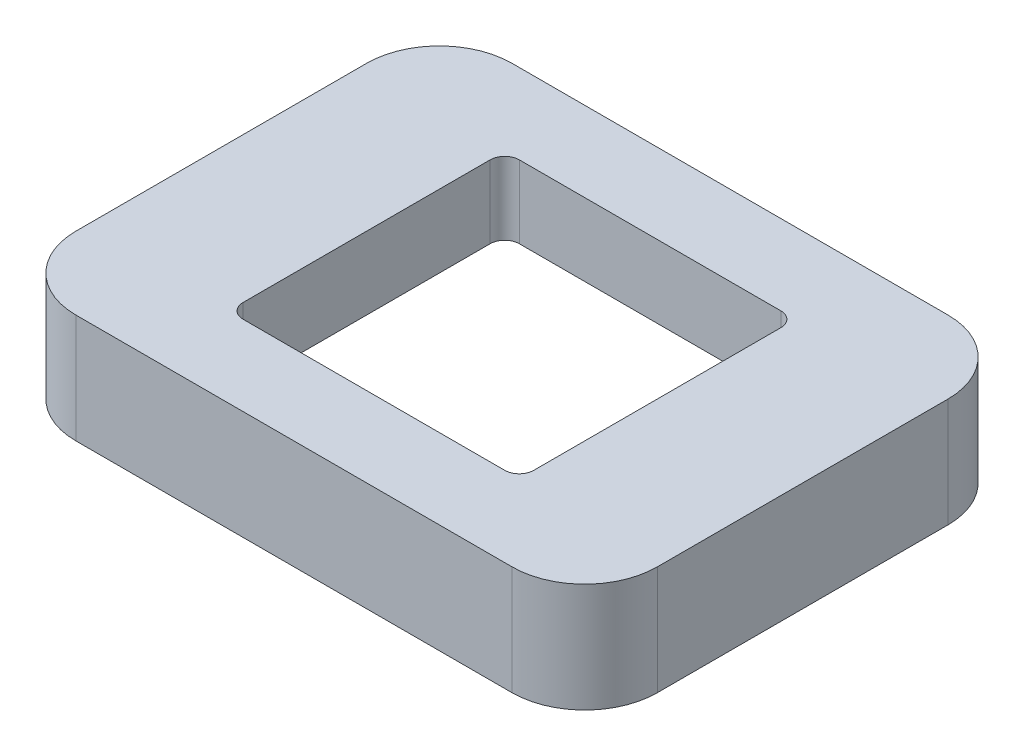
ISO-10303-21;
HEADER;
FILE_DESCRIPTION(('STEP AP214'),'2;1');
FILE_NAME('part.step','',(''),(''),'','','');
FILE_SCHEMA(('AUTOMOTIVE_DESIGN { 1 0 10303 214 1 1 1 1 }'));
ENDSEC;
DATA;
#1=APPLICATION_CONTEXT('core data for automotive mechanical design processes');
#2=APPLICATION_PROTOCOL_DEFINITION('international standard','automotive_design',2000,#1);
#3=PRODUCT_CONTEXT('',#1,'mechanical');
#4=PRODUCT('Part','Part','',(#3));
#5=PRODUCT_RELATED_PRODUCT_CATEGORY('part','',(#4));
#6=PRODUCT_DEFINITION_FORMATION('','',#4);
#7=PRODUCT_DEFINITION_CONTEXT('part definition',#1,'design');
#8=PRODUCT_DEFINITION('design','',#6,#7);
#9=PRODUCT_DEFINITION_SHAPE('','',#8);
#10=(LENGTH_UNIT() NAMED_UNIT(*) SI_UNIT(.MILLI.,.METRE.));
#11=(NAMED_UNIT(*) PLANE_ANGLE_UNIT() SI_UNIT($,.RADIAN.));
#12=(NAMED_UNIT(*) SI_UNIT($,.STERADIAN.) SOLID_ANGLE_UNIT());
#13=UNCERTAINTY_MEASURE_WITH_UNIT(LENGTH_MEASURE(1.E-05),#10,'distance_accuracy_value','');
#14=(GEOMETRIC_REPRESENTATION_CONTEXT(3) GLOBAL_UNCERTAINTY_ASSIGNED_CONTEXT((#13)) GLOBAL_UNIT_ASSIGNED_CONTEXT((#10,
#11,#12)) REPRESENTATION_CONTEXT('',''));
#15=CARTESIAN_POINT('',(0.,0.,0.));
#16=DIRECTION('',(0.,0.,1.));
#17=DIRECTION('',(1.,0.,0.));
#18=AXIS2_PLACEMENT_3D('',#15,#16,#17);
#19=CARTESIAN_POINT('',(10.,15.,50.));
#20=DIRECTION('',(0.,1.,0.));
#21=DIRECTION('',(0.,0.,1.));
#22=AXIS2_PLACEMENT_3D('',#19,#20,#21);
#23=PLANE('',#22);
#24=CARTESIAN_POINT('',(10.,15.,50.));
#25=DIRECTION('',(0.,1.,0.));
#26=DIRECTION('',(0.,0.,1.));
#27=AXIS2_PLACEMENT_3D('',#24,#25,#26);
#28=CIRCLE('',#27,10.);
#29=CARTESIAN_POINT('',(0.,15.,49.9999999999999));
#30=VERTEX_POINT('',#29);
#31=CARTESIAN_POINT('',(10.0000000000001,15.,60.));
#32=VERTEX_POINT('',#31);
#33=EDGE_CURVE('E376',#30,#32,#28,.T.);
#34=ORIENTED_EDGE('',*,*,#33,.T.);
#35=DIRECTION('',(1.,0.,0.));
#36=VECTOR('',#35,1.);
#37=CARTESIAN_POINT('',(10.0000000000001,15.,60.));
#38=LINE('',#37,#36);
#39=CARTESIAN_POINT('',(69.9999999999999,15.,60.));
#40=VERTEX_POINT('',#39);
#41=EDGE_CURVE('E380',#32,#40,#38,.T.);
#42=ORIENTED_EDGE('',*,*,#41,.T.);
#43=CARTESIAN_POINT('',(70.,15.,50.));
#44=DIRECTION('',(0.,1.,0.));
#45=DIRECTION('',(0.,0.,-1.));
#46=AXIS2_PLACEMENT_3D('',#43,#44,#45);
#47=CIRCLE('',#46,10.);
#48=CARTESIAN_POINT('',(80.,15.,49.9999999999999));
#49=VERTEX_POINT('',#48);
#50=EDGE_CURVE('E384',#40,#49,#47,.T.);
#51=ORIENTED_EDGE('',*,*,#50,.T.);
#52=DIRECTION('',(0.,0.,-1.));
#53=VECTOR('',#52,1.);
#54=CARTESIAN_POINT('',(80.,15.,10.0000000000001));
#55=LINE('',#54,#53);
#56=CARTESIAN_POINT('',(80.,15.,10.0000000000001));
#57=VERTEX_POINT('',#56);
#58=EDGE_CURVE('E387',#49,#57,#55,.T.);
#59=ORIENTED_EDGE('',*,*,#58,.T.);
#60=CARTESIAN_POINT('',(70.,15.,10.));
#61=DIRECTION('',(0.,1.,0.));
#62=DIRECTION('',(0.,0.,-1.));
#63=AXIS2_PLACEMENT_3D('',#60,#61,#62);
#64=CIRCLE('',#63,10.);
#65=CARTESIAN_POINT('',(69.9999999999999,15.,0.));
#66=VERTEX_POINT('',#65);
#67=EDGE_CURVE('E390',#57,#66,#64,.T.);
#68=ORIENTED_EDGE('',*,*,#67,.T.);
#69=DIRECTION('',(-1.,0.,0.));
#70=VECTOR('',#69,1.);
#71=CARTESIAN_POINT('',(10.0000000000001,15.,0.));
#72=LINE('',#71,#70);
#73=CARTESIAN_POINT('',(10.,15.,0.));
#74=VERTEX_POINT('',#73);
#75=EDGE_CURVE('E393',#66,#74,#72,.T.);
#76=ORIENTED_EDGE('',*,*,#75,.T.);
#77=CARTESIAN_POINT('',(10.,15.,10.));
#78=DIRECTION('',(0.,1.,0.));
#79=DIRECTION('',(0.,0.,-1.));
#80=AXIS2_PLACEMENT_3D('',#77,#78,#79);
#81=CIRCLE('',#80,10.);
#82=CARTESIAN_POINT('',(0.,15.,10.0000000000001));
#83=VERTEX_POINT('',#82);
#84=EDGE_CURVE('E396',#74,#83,#81,.T.);
#85=ORIENTED_EDGE('',*,*,#84,.T.);
#86=DIRECTION('',(0.,0.,1.));
#87=VECTOR('',#86,1.);
#88=CARTESIAN_POINT('',(0.,15.,10.0000000000001));
#89=LINE('',#88,#87);
#90=EDGE_CURVE('E399',#83,#30,#89,.T.);
#91=ORIENTED_EDGE('',*,*,#90,.T.);
#92=EDGE_LOOP('',(#34,#42,#51,#59,#68,#76,#85,#91));
#93=FACE_BOUND('',#92,.T.);
#94=DIRECTION('',(-1.,0.,0.));
#95=VECTOR('',#94,1.);
#96=CARTESIAN_POINT('',(58.,15.,11.));
#97=LINE('',#96,#95);
#98=CARTESIAN_POINT('',(58.,15.,11.));
#99=VERTEX_POINT('',#98);
#100=CARTESIAN_POINT('',(22.,15.,11.));
#101=VERTEX_POINT('',#100);
#102=EDGE_CURVE('E321',#99,#101,#97,.T.);
#103=ORIENTED_EDGE('',*,*,#102,.F.);
#104=CARTESIAN_POINT('',(58.,15.,13.));
#105=DIRECTION('',(0.,1.,0.));
#106=DIRECTION('',(0.,0.,1.));
#107=AXIS2_PLACEMENT_3D('',#104,#105,#106);
#108=CIRCLE('',#107,2.);
#109=CARTESIAN_POINT('',(60.,15.,13.));
#110=VERTEX_POINT('',#109);
#111=EDGE_CURVE('E318',#110,#99,#108,.T.);
#112=ORIENTED_EDGE('',*,*,#111,.F.);
#113=DIRECTION('',(0.,0.,-1.));
#114=VECTOR('',#113,1.);
#115=CARTESIAN_POINT('',(60.,15.,47.));
#116=LINE('',#115,#114);
#117=CARTESIAN_POINT('',(60.,15.,47.));
#118=VERTEX_POINT('',#117);
#119=EDGE_CURVE('E340',#118,#110,#116,.T.);
#120=ORIENTED_EDGE('',*,*,#119,.F.);
#121=CARTESIAN_POINT('',(58.,15.,47.));
#122=DIRECTION('',(0.,1.,0.));
#123=DIRECTION('',(0.,0.,-1.));
#124=AXIS2_PLACEMENT_3D('',#121,#122,#123);
#125=CIRCLE('',#124,2.);
#126=CARTESIAN_POINT('',(58.,15.,49.));
#127=VERTEX_POINT('',#126);
#128=EDGE_CURVE('E336',#127,#118,#125,.T.);
#129=ORIENTED_EDGE('',*,*,#128,.F.);
#130=DIRECTION('',(1.,0.,0.));
#131=VECTOR('',#130,1.);
#132=CARTESIAN_POINT('',(58.,15.,49.));
#133=LINE('',#132,#131);
#134=CARTESIAN_POINT('',(22.,15.,49.));
#135=VERTEX_POINT('',#134);
#136=EDGE_CURVE('E333',#135,#127,#133,.T.);
#137=ORIENTED_EDGE('',*,*,#136,.F.);
#138=CARTESIAN_POINT('',(22.,15.,47.));
#139=DIRECTION('',(0.,1.,0.));
#140=DIRECTION('',(0.,0.,1.));
#141=AXIS2_PLACEMENT_3D('',#138,#139,#140);
#142=CIRCLE('',#141,2.);
#143=CARTESIAN_POINT('',(20.,15.,47.));
#144=VERTEX_POINT('',#143);
#145=EDGE_CURVE('E330',#144,#135,#142,.T.);
#146=ORIENTED_EDGE('',*,*,#145,.F.);
#147=DIRECTION('',(0.,0.,1.));
#148=VECTOR('',#147,1.);
#149=CARTESIAN_POINT('',(20.,15.,47.));
#150=LINE('',#149,#148);
#151=CARTESIAN_POINT('',(20.,15.,13.));
#152=VERTEX_POINT('',#151);
#153=EDGE_CURVE('E327',#152,#144,#150,.T.);
#154=ORIENTED_EDGE('',*,*,#153,.F.);
#155=CARTESIAN_POINT('',(22.,15.,13.));
#156=DIRECTION('',(0.,1.,0.));
#157=DIRECTION('',(0.,0.,1.));
#158=AXIS2_PLACEMENT_3D('',#155,#156,#157);
#159=CIRCLE('',#158,2.);
#160=EDGE_CURVE('E324',#101,#152,#159,.T.);
#161=ORIENTED_EDGE('',*,*,#160,.F.);
#162=EDGE_LOOP('',(#103,#112,#120,#129,#137,#146,#154,#161));
#163=FACE_BOUND('',#162,.T.);
#164=ADVANCED_FACE('F39',(#93,#163),#23,.T.);
#165=CARTESIAN_POINT('',(10.,0.,50.));
#166=DIRECTION('',(0.,1.,0.));
#167=DIRECTION('',(0.,0.,1.));
#168=AXIS2_PLACEMENT_3D('',#165,#166,#167);
#169=PLANE('',#168);
#170=DIRECTION('',(0.,0.,-1.));
#171=VECTOR('',#170,1.);
#172=CARTESIAN_POINT('',(3.,0.,52.));
#173=LINE('',#172,#171);
#174=CARTESIAN_POINT('',(3.,0.,52.));
#175=VERTEX_POINT('',#174);
#176=CARTESIAN_POINT('',(3.00000000000001,0.,8.));
#177=VERTEX_POINT('',#176);
#178=EDGE_CURVE('E255',#175,#177,#173,.T.);
#179=ORIENTED_EDGE('',*,*,#178,.F.);
#180=CARTESIAN_POINT('',(8.,0.,52.));
#181=DIRECTION('',(0.,-1.,0.));
#182=DIRECTION('',(0.,0.,1.));
#183=AXIS2_PLACEMENT_3D('',#180,#181,#182);
#184=CIRCLE('',#183,5.);
#185=CARTESIAN_POINT('',(8.,0.,57.));
#186=VERTEX_POINT('',#185);
#187=EDGE_CURVE('E55',#186,#175,#184,.T.);
#188=ORIENTED_EDGE('',*,*,#187,.F.);
#189=DIRECTION('',(-1.,0.,0.));
#190=VECTOR('',#189,1.);
#191=CARTESIAN_POINT('',(8.,0.,57.));
#192=LINE('',#191,#190);
#193=CARTESIAN_POINT('',(72.,0.,57.));
#194=VERTEX_POINT('',#193);
#195=EDGE_CURVE('E224',#194,#186,#192,.T.);
#196=ORIENTED_EDGE('',*,*,#195,.F.);
#197=CARTESIAN_POINT('',(72.,0.,52.));
#198=DIRECTION('',(0.,-1.,0.));
#199=DIRECTION('',(0.,0.,-1.));
#200=AXIS2_PLACEMENT_3D('',#197,#198,#199);
#201=CIRCLE('',#200,5.);
#202=CARTESIAN_POINT('',(77.,0.,52.));
#203=VERTEX_POINT('',#202);
#204=EDGE_CURVE('E228',#203,#194,#201,.T.);
#205=ORIENTED_EDGE('',*,*,#204,.F.);
#206=DIRECTION('',(0.,0.,1.));
#207=VECTOR('',#206,1.);
#208=CARTESIAN_POINT('',(77.,0.,52.));
#209=LINE('',#208,#207);
#210=CARTESIAN_POINT('',(77.,0.,8.));
#211=VERTEX_POINT('',#210);
#212=EDGE_CURVE('E271',#211,#203,#209,.T.);
#213=ORIENTED_EDGE('',*,*,#212,.F.);
#214=CARTESIAN_POINT('',(72.,0.,8.));
#215=DIRECTION('',(0.,-1.,0.));
#216=DIRECTION('',(0.,0.,-1.));
#217=AXIS2_PLACEMENT_3D('',#214,#215,#216);
#218=CIRCLE('',#217,5.00000000000001);
#219=CARTESIAN_POINT('',(72.,0.,3.));
#220=VERTEX_POINT('',#219);
#221=EDGE_CURVE('E267',#220,#211,#218,.T.);
#222=ORIENTED_EDGE('',*,*,#221,.F.);
#223=DIRECTION('',(1.,0.,0.));
#224=VECTOR('',#223,1.);
#225=CARTESIAN_POINT('',(8.00000000000001,0.,3.));
#226=LINE('',#225,#224);
#227=CARTESIAN_POINT('',(8.00000000000001,0.,3.));
#228=VERTEX_POINT('',#227);
#229=EDGE_CURVE('E263',#228,#220,#226,.T.);
#230=ORIENTED_EDGE('',*,*,#229,.F.);
#231=CARTESIAN_POINT('',(8.00000000000001,0.,8.));
#232=DIRECTION('',(0.,-1.,0.));
#233=DIRECTION('',(0.,0.,-1.));
#234=AXIS2_PLACEMENT_3D('',#231,#232,#233);
#235=CIRCLE('',#234,5.);
#236=EDGE_CURVE('E259',#177,#228,#235,.T.);
#237=ORIENTED_EDGE('',*,*,#236,.F.);
#238=EDGE_LOOP('',(#179,#188,#196,#205,#213,#222,#230,#237));
#239=FACE_BOUND('',#238,.T.);
#240=CARTESIAN_POINT('',(10.,0.,50.));
#241=DIRECTION('',(0.,1.,0.));
#242=DIRECTION('',(0.,0.,1.));
#243=AXIS2_PLACEMENT_3D('',#240,#241,#242);
#244=CIRCLE('',#243,10.);
#245=CARTESIAN_POINT('',(0.,0.,49.9999999999999));
#246=VERTEX_POINT('',#245);
#247=CARTESIAN_POINT('',(10.0000000000001,0.,60.));
#248=VERTEX_POINT('',#247);
#249=EDGE_CURVE('E375',#246,#248,#244,.T.);
#250=ORIENTED_EDGE('',*,*,#249,.F.);
#251=DIRECTION('',(0.,0.,1.));
#252=VECTOR('',#251,1.);
#253=CARTESIAN_POINT('',(0.,0.,10.0000000000001));
#254=LINE('',#253,#252);
#255=CARTESIAN_POINT('',(0.,0.,10.0000000000001));
#256=VERTEX_POINT('',#255);
#257=EDGE_CURVE('E381',#256,#246,#254,.T.);
#258=ORIENTED_EDGE('',*,*,#257,.F.);
#259=CARTESIAN_POINT('',(10.,0.,10.));
#260=DIRECTION('',(0.,1.,0.));
#261=DIRECTION('',(0.,0.,-1.));
#262=AXIS2_PLACEMENT_3D('',#259,#260,#261);
#263=CIRCLE('',#262,10.);
#264=CARTESIAN_POINT('',(10.,0.,0.));
#265=VERTEX_POINT('',#264);
#266=EDGE_CURVE('E421',#265,#256,#263,.T.);
#267=ORIENTED_EDGE('',*,*,#266,.F.);
#268=DIRECTION('',(-1.,0.,0.));
#269=VECTOR('',#268,1.);
#270=CARTESIAN_POINT('',(10.0000000000001,0.,0.));
#271=LINE('',#270,#269);
#272=CARTESIAN_POINT('',(69.9999999999999,0.,0.));
#273=VERTEX_POINT('',#272);
#274=EDGE_CURVE('E418',#273,#265,#271,.T.);
#275=ORIENTED_EDGE('',*,*,#274,.F.);
#276=CARTESIAN_POINT('',(70.,0.,10.));
#277=DIRECTION('',(0.,1.,0.));
#278=DIRECTION('',(0.,0.,-1.));
#279=AXIS2_PLACEMENT_3D('',#276,#277,#278);
#280=CIRCLE('',#279,10.);
#281=CARTESIAN_POINT('',(80.,0.,10.0000000000001));
#282=VERTEX_POINT('',#281);
#283=EDGE_CURVE('E415',#282,#273,#280,.T.);
#284=ORIENTED_EDGE('',*,*,#283,.F.);
#285=DIRECTION('',(0.,0.,-1.));
#286=VECTOR('',#285,1.);
#287=CARTESIAN_POINT('',(80.,0.,10.0000000000001));
#288=LINE('',#287,#286);
#289=CARTESIAN_POINT('',(80.,0.,49.9999999999999));
#290=VERTEX_POINT('',#289);
#291=EDGE_CURVE('E412',#290,#282,#288,.T.);
#292=ORIENTED_EDGE('',*,*,#291,.F.);
#293=CARTESIAN_POINT('',(70.,0.,50.));
#294=DIRECTION('',(0.,1.,0.));
#295=DIRECTION('',(0.,0.,-1.));
#296=AXIS2_PLACEMENT_3D('',#293,#294,#295);
#297=CIRCLE('',#296,10.);
#298=CARTESIAN_POINT('',(69.9999999999999,0.,60.));
#299=VERTEX_POINT('',#298);
#300=EDGE_CURVE('E409',#299,#290,#297,.T.);
#301=ORIENTED_EDGE('',*,*,#300,.F.);
#302=DIRECTION('',(1.,0.,0.));
#303=VECTOR('',#302,1.);
#304=CARTESIAN_POINT('',(10.0000000000001,0.,60.));
#305=LINE('',#304,#303);
#306=EDGE_CURVE('E406',#248,#299,#305,.T.);
#307=ORIENTED_EDGE('',*,*,#306,.F.);
#308=EDGE_LOOP('',(#250,#258,#267,#275,#284,#292,#301,#307));
#309=FACE_BOUND('',#308,.T.);
#310=ADVANCED_FACE('F464',(#239,#309),#169,.F.);
#311=CARTESIAN_POINT('',(10.,15.,50.));
#312=DIRECTION('',(0.,-1.,0.));
#313=DIRECTION('',(0.,0.,-1.));
#314=AXIS2_PLACEMENT_3D('',#311,#312,#313);
#315=CYLINDRICAL_SURFACE('',#314,10.);
#316=ORIENTED_EDGE('',*,*,#249,.T.);
#317=DIRECTION('',(0.,-1.,0.));
#318=VECTOR('',#317,1.);
#319=CARTESIAN_POINT('',(10.0000000000001,15.,60.));
#320=LINE('',#319,#318);
#321=EDGE_CURVE('E48',#32,#248,#320,.T.);
#322=ORIENTED_EDGE('',*,*,#321,.F.);
#323=ORIENTED_EDGE('',*,*,#33,.F.);
#324=DIRECTION('',(0.,-1.,0.));
#325=VECTOR('',#324,1.);
#326=CARTESIAN_POINT('',(0.,15.,49.9999999999999));
#327=LINE('',#326,#325);
#328=EDGE_CURVE('E402',#30,#246,#327,.T.);
#329=ORIENTED_EDGE('',*,*,#328,.T.);
#330=EDGE_LOOP('',(#316,#322,#323,#329));
#331=FACE_BOUND('',#330,.T.);
#332=ADVANCED_FACE('F41',(#331),#315,.T.);
#333=CARTESIAN_POINT('',(10.0000000000001,15.,60.));
#334=DIRECTION('',(0.,0.,-1.));
#335=DIRECTION('',(-1.,0.,0.));
#336=AXIS2_PLACEMENT_3D('',#333,#334,#335);
#337=PLANE('',#336);
#338=ORIENTED_EDGE('',*,*,#306,.T.);
#339=DIRECTION('',(0.,-1.,0.));
#340=VECTOR('',#339,1.);
#341=CARTESIAN_POINT('',(69.9999999999999,15.,60.));
#342=LINE('',#341,#340);
#343=EDGE_CURVE('E449',#40,#299,#342,.T.);
#344=ORIENTED_EDGE('',*,*,#343,.F.);
#345=ORIENTED_EDGE('',*,*,#41,.F.);
#346=ORIENTED_EDGE('',*,*,#321,.T.);
#347=EDGE_LOOP('',(#338,#344,#345,#346));
#348=FACE_BOUND('',#347,.T.);
#349=ADVANCED_FACE('F456',(#348),#337,.F.);
#350=CARTESIAN_POINT('',(70.,15.,50.));
#351=DIRECTION('',(0.,-1.,0.));
#352=DIRECTION('',(0.,0.,-1.));
#353=AXIS2_PLACEMENT_3D('',#350,#351,#352);
#354=CYLINDRICAL_SURFACE('',#353,10.);
#355=ORIENTED_EDGE('',*,*,#300,.T.);
#356=DIRECTION('',(0.,-1.,0.));
#357=VECTOR('',#356,1.);
#358=CARTESIAN_POINT('',(80.,15.,49.9999999999999));
#359=LINE('',#358,#357);
#360=EDGE_CURVE('E445',#49,#290,#359,.T.);
#361=ORIENTED_EDGE('',*,*,#360,.F.);
#362=ORIENTED_EDGE('',*,*,#50,.F.);
#363=ORIENTED_EDGE('',*,*,#343,.T.);
#364=EDGE_LOOP('',(#355,#361,#362,#363));
#365=FACE_BOUND('',#364,.T.);
#366=ADVANCED_FACE('F471',(#365),#354,.T.);
#367=CARTESIAN_POINT('',(80.,15.,10.0000000000001));
#368=DIRECTION('',(-1.,0.,0.));
#369=DIRECTION('',(0.,0.,1.));
#370=AXIS2_PLACEMENT_3D('',#367,#368,#369);
#371=PLANE('',#370);
#372=ORIENTED_EDGE('',*,*,#291,.T.);
#373=DIRECTION('',(0.,-1.,0.));
#374=VECTOR('',#373,1.);
#375=CARTESIAN_POINT('',(80.,15.,10.0000000000001));
#376=LINE('',#375,#374);
#377=EDGE_CURVE('E441',#57,#282,#376,.T.);
#378=ORIENTED_EDGE('',*,*,#377,.F.);
#379=ORIENTED_EDGE('',*,*,#58,.F.);
#380=ORIENTED_EDGE('',*,*,#360,.T.);
#381=EDGE_LOOP('',(#372,#378,#379,#380));
#382=FACE_BOUND('',#381,.T.);
#383=ADVANCED_FACE('F475',(#382),#371,.F.);
#384=CARTESIAN_POINT('',(70.,15.,10.));
#385=DIRECTION('',(0.,-1.,0.));
#386=DIRECTION('',(0.,0.,-1.));
#387=AXIS2_PLACEMENT_3D('',#384,#385,#386);
#388=CYLINDRICAL_SURFACE('',#387,10.);
#389=ORIENTED_EDGE('',*,*,#283,.T.);
#390=DIRECTION('',(0.,-1.,0.));
#391=VECTOR('',#390,1.);
#392=CARTESIAN_POINT('',(69.9999999999999,15.,0.));
#393=LINE('',#392,#391);
#394=EDGE_CURVE('E437',#66,#273,#393,.T.);
#395=ORIENTED_EDGE('',*,*,#394,.F.);
#396=ORIENTED_EDGE('',*,*,#67,.F.);
#397=ORIENTED_EDGE('',*,*,#377,.T.);
#398=EDGE_LOOP('',(#389,#395,#396,#397));
#399=FACE_BOUND('',#398,.T.);
#400=ADVANCED_FACE('F494',(#399),#388,.T.);
#401=CARTESIAN_POINT('',(10.0000000000001,15.,0.));
#402=DIRECTION('',(0.,0.,1.));
#403=DIRECTION('',(1.,0.,0.));
#404=AXIS2_PLACEMENT_3D('',#401,#402,#403);
#405=PLANE('',#404);
#406=ORIENTED_EDGE('',*,*,#274,.T.);
#407=DIRECTION('',(0.,-1.,0.));
#408=VECTOR('',#407,1.);
#409=CARTESIAN_POINT('',(10.,15.,0.));
#410=LINE('',#409,#408);
#411=EDGE_CURVE('E433',#74,#265,#410,.T.);
#412=ORIENTED_EDGE('',*,*,#411,.F.);
#413=ORIENTED_EDGE('',*,*,#75,.F.);
#414=ORIENTED_EDGE('',*,*,#394,.T.);
#415=EDGE_LOOP('',(#406,#412,#413,#414));
#416=FACE_BOUND('',#415,.T.);
#417=ADVANCED_FACE('F491',(#416),#405,.F.);
#418=CARTESIAN_POINT('',(10.,15.,10.));
#419=DIRECTION('',(0.,-1.,0.));
#420=DIRECTION('',(0.,0.,-1.));
#421=AXIS2_PLACEMENT_3D('',#418,#419,#420);
#422=CYLINDRICAL_SURFACE('',#421,10.);
#423=ORIENTED_EDGE('',*,*,#266,.T.);
#424=DIRECTION('',(0.,-1.,0.));
#425=VECTOR('',#424,1.);
#426=CARTESIAN_POINT('',(0.,15.,10.0000000000001));
#427=LINE('',#426,#425);
#428=EDGE_CURVE('E429',#83,#256,#427,.T.);
#429=ORIENTED_EDGE('',*,*,#428,.F.);
#430=ORIENTED_EDGE('',*,*,#84,.F.);
#431=ORIENTED_EDGE('',*,*,#411,.T.);
#432=EDGE_LOOP('',(#423,#429,#430,#431));
#433=FACE_BOUND('',#432,.T.);
#434=ADVANCED_FACE('F487',(#433),#422,.T.);
#435=CARTESIAN_POINT('',(0.,15.,10.0000000000001));
#436=DIRECTION('',(1.,0.,0.));
#437=DIRECTION('',(0.,0.,-1.));
#438=AXIS2_PLACEMENT_3D('',#435,#436,#437);
#439=PLANE('',#438);
#440=ORIENTED_EDGE('',*,*,#257,.T.);
#441=ORIENTED_EDGE('',*,*,#328,.F.);
#442=ORIENTED_EDGE('',*,*,#90,.F.);
#443=ORIENTED_EDGE('',*,*,#428,.T.);
#444=EDGE_LOOP('',(#440,#441,#442,#443));
#445=FACE_BOUND('',#444,.T.);
#446=ADVANCED_FACE('F485',(#445),#439,.F.);
#447=CARTESIAN_POINT('',(58.,15.,13.));
#448=DIRECTION('',(0.,-1.,0.));
#449=DIRECTION('',(0.,0.,-1.));
#450=AXIS2_PLACEMENT_3D('',#447,#448,#449);
#451=CYLINDRICAL_SURFACE('',#450,2.);
#452=CARTESIAN_POINT('',(58.,5.,13.));
#453=DIRECTION('',(0.,1.,0.));
#454=DIRECTION('',(0.,0.,1.));
#455=AXIS2_PLACEMENT_3D('',#452,#453,#454);
#456=CIRCLE('',#455,2.);
#457=CARTESIAN_POINT('',(60.,5.,13.));
#458=VERTEX_POINT('',#457);
#459=CARTESIAN_POINT('',(58.,5.,11.));
#460=VERTEX_POINT('',#459);
#461=EDGE_CURVE('E315',#458,#460,#456,.T.);
#462=ORIENTED_EDGE('',*,*,#461,.F.);
#463=DIRECTION('',(0.,-1.,0.));
#464=VECTOR('',#463,1.);
#465=CARTESIAN_POINT('',(60.,15.,13.));
#466=LINE('',#465,#464);
#467=EDGE_CURVE('E343',#110,#458,#466,.T.);
#468=ORIENTED_EDGE('',*,*,#467,.F.);
#469=ORIENTED_EDGE('',*,*,#111,.T.);
#470=DIRECTION('',(0.,-1.,0.));
#471=VECTOR('',#470,1.);
#472=CARTESIAN_POINT('',(58.,15.,11.));
#473=LINE('',#472,#471);
#474=EDGE_CURVE('E371',#99,#460,#473,.T.);
#475=ORIENTED_EDGE('',*,*,#474,.T.);
#476=EDGE_LOOP('',(#462,#468,#469,#475));
#477=FACE_BOUND('',#476,.T.);
#478=ADVANCED_FACE('F511',(#477),#451,.F.);
#479=CARTESIAN_POINT('',(58.,15.,11.));
#480=DIRECTION('',(0.,0.,1.));
#481=DIRECTION('',(1.,0.,0.));
#482=AXIS2_PLACEMENT_3D('',#479,#480,#481);
#483=PLANE('',#482);
#484=DIRECTION('',(-1.,0.,0.));
#485=VECTOR('',#484,1.);
#486=CARTESIAN_POINT('',(58.,5.,11.));
#487=LINE('',#486,#485);
#488=CARTESIAN_POINT('',(22.,5.,11.));
#489=VERTEX_POINT('',#488);
#490=EDGE_CURVE('E312',#460,#489,#487,.T.);
#491=ORIENTED_EDGE('',*,*,#490,.F.);
#492=ORIENTED_EDGE('',*,*,#474,.F.);
#493=ORIENTED_EDGE('',*,*,#102,.T.);
#494=DIRECTION('',(0.,-1.,0.));
#495=VECTOR('',#494,1.);
#496=CARTESIAN_POINT('',(22.,15.,11.));
#497=LINE('',#496,#495);
#498=EDGE_CURVE('E367',#101,#489,#497,.T.);
#499=ORIENTED_EDGE('',*,*,#498,.T.);
#500=EDGE_LOOP('',(#491,#492,#493,#499));
#501=FACE_BOUND('',#500,.T.);
#502=ADVANCED_FACE('F532',(#501),#483,.T.);
#503=CARTESIAN_POINT('',(22.,15.,13.));
#504=DIRECTION('',(0.,-1.,0.));
#505=DIRECTION('',(0.,0.,-1.));
#506=AXIS2_PLACEMENT_3D('',#503,#504,#505);
#507=CYLINDRICAL_SURFACE('',#506,2.);
#508=CARTESIAN_POINT('',(22.,5.,13.));
#509=DIRECTION('',(0.,1.,0.));
#510=DIRECTION('',(0.,0.,1.));
#511=AXIS2_PLACEMENT_3D('',#508,#509,#510);
#512=CIRCLE('',#511,2.);
#513=CARTESIAN_POINT('',(20.,5.,13.));
#514=VERTEX_POINT('',#513);
#515=EDGE_CURVE('E309',#489,#514,#512,.T.);
#516=ORIENTED_EDGE('',*,*,#515,.F.);
#517=ORIENTED_EDGE('',*,*,#498,.F.);
#518=ORIENTED_EDGE('',*,*,#160,.T.);
#519=DIRECTION('',(0.,-1.,0.));
#520=VECTOR('',#519,1.);
#521=CARTESIAN_POINT('',(20.,15.,13.));
#522=LINE('',#521,#520);
#523=EDGE_CURVE('E363',#152,#514,#522,.T.);
#524=ORIENTED_EDGE('',*,*,#523,.T.);
#525=EDGE_LOOP('',(#516,#517,#518,#524));
#526=FACE_BOUND('',#525,.T.);
#527=ADVANCED_FACE('F539',(#526),#507,.F.);
#528=CARTESIAN_POINT('',(20.,15.,47.));
#529=DIRECTION('',(1.,0.,0.));
#530=DIRECTION('',(0.,0.,-1.));
#531=AXIS2_PLACEMENT_3D('',#528,#529,#530);
#532=PLANE('',#531);
#533=DIRECTION('',(0.,0.,1.));
#534=VECTOR('',#533,1.);
#535=CARTESIAN_POINT('',(20.,5.,47.));
#536=LINE('',#535,#534);
#537=CARTESIAN_POINT('',(20.,5.,47.));
#538=VERTEX_POINT('',#537);
#539=EDGE_CURVE('E306',#514,#538,#536,.T.);
#540=ORIENTED_EDGE('',*,*,#539,.F.);
#541=ORIENTED_EDGE('',*,*,#523,.F.);
#542=ORIENTED_EDGE('',*,*,#153,.T.);
#543=DIRECTION('',(0.,-1.,0.));
#544=VECTOR('',#543,1.);
#545=CARTESIAN_POINT('',(20.,15.,47.));
#546=LINE('',#545,#544);
#547=EDGE_CURVE('E359',#144,#538,#546,.T.);
#548=ORIENTED_EDGE('',*,*,#547,.T.);
#549=EDGE_LOOP('',(#540,#541,#542,#548));
#550=FACE_BOUND('',#549,.T.);
#551=ADVANCED_FACE('F546',(#550),#532,.T.);
#552=CARTESIAN_POINT('',(22.,15.,47.));
#553=DIRECTION('',(0.,-1.,0.));
#554=DIRECTION('',(0.,0.,-1.));
#555=AXIS2_PLACEMENT_3D('',#552,#553,#554);
#556=CYLINDRICAL_SURFACE('',#555,2.);
#557=CARTESIAN_POINT('',(22.,5.,47.));
#558=DIRECTION('',(0.,1.,0.));
#559=DIRECTION('',(0.,0.,1.));
#560=AXIS2_PLACEMENT_3D('',#557,#558,#559);
#561=CIRCLE('',#560,2.);
#562=CARTESIAN_POINT('',(22.,5.,49.));
#563=VERTEX_POINT('',#562);
#564=EDGE_CURVE('E303',#538,#563,#561,.T.);
#565=ORIENTED_EDGE('',*,*,#564,.F.);
#566=ORIENTED_EDGE('',*,*,#547,.F.);
#567=ORIENTED_EDGE('',*,*,#145,.T.);
#568=DIRECTION('',(0.,-1.,0.));
#569=VECTOR('',#568,1.);
#570=CARTESIAN_POINT('',(22.,15.,49.));
#571=LINE('',#570,#569);
#572=EDGE_CURVE('E355',#135,#563,#571,.T.);
#573=ORIENTED_EDGE('',*,*,#572,.T.);
#574=EDGE_LOOP('',(#565,#566,#567,#573));
#575=FACE_BOUND('',#574,.T.);
#576=ADVANCED_FACE('F554',(#575),#556,.F.);
#577=CARTESIAN_POINT('',(58.,15.,49.));
#578=DIRECTION('',(0.,0.,-1.));
#579=DIRECTION('',(-1.,0.,0.));
#580=AXIS2_PLACEMENT_3D('',#577,#578,#579);
#581=PLANE('',#580);
#582=DIRECTION('',(1.,0.,0.));
#583=VECTOR('',#582,1.);
#584=CARTESIAN_POINT('',(58.,5.,49.));
#585=LINE('',#584,#583);
#586=CARTESIAN_POINT('',(58.,5.,49.));
#587=VERTEX_POINT('',#586);
#588=EDGE_CURVE('E300',#563,#587,#585,.T.);
#589=ORIENTED_EDGE('',*,*,#588,.F.);
#590=ORIENTED_EDGE('',*,*,#572,.F.);
#591=ORIENTED_EDGE('',*,*,#136,.T.);
#592=DIRECTION('',(0.,-1.,0.));
#593=VECTOR('',#592,1.);
#594=CARTESIAN_POINT('',(58.,15.,49.));
#595=LINE('',#594,#593);
#596=EDGE_CURVE('E351',#127,#587,#595,.T.);
#597=ORIENTED_EDGE('',*,*,#596,.T.);
#598=EDGE_LOOP('',(#589,#590,#591,#597));
#599=FACE_BOUND('',#598,.T.);
#600=ADVANCED_FACE('F562',(#599),#581,.T.);
#601=CARTESIAN_POINT('',(58.,15.,47.));
#602=DIRECTION('',(0.,-1.,0.));
#603=DIRECTION('',(0.,0.,-1.));
#604=AXIS2_PLACEMENT_3D('',#601,#602,#603);
#605=CYLINDRICAL_SURFACE('',#604,2.);
#606=CARTESIAN_POINT('',(58.,5.,47.));
#607=DIRECTION('',(0.,1.,0.));
#608=DIRECTION('',(0.,0.,1.));
#609=AXIS2_PLACEMENT_3D('',#606,#607,#608);
#610=CIRCLE('',#609,2.);
#611=CARTESIAN_POINT('',(60.,5.,47.));
#612=VERTEX_POINT('',#611);
#613=EDGE_CURVE('E62',#587,#612,#610,.T.);
#614=ORIENTED_EDGE('',*,*,#613,.F.);
#615=ORIENTED_EDGE('',*,*,#596,.F.);
#616=ORIENTED_EDGE('',*,*,#128,.T.);
#617=DIRECTION('',(0.,-1.,0.));
#618=VECTOR('',#617,1.);
#619=CARTESIAN_POINT('',(60.,15.,47.));
#620=LINE('',#619,#618);
#621=EDGE_CURVE('E347',#118,#612,#620,.T.);
#622=ORIENTED_EDGE('',*,*,#621,.T.);
#623=EDGE_LOOP('',(#614,#615,#616,#622));
#624=FACE_BOUND('',#623,.T.);
#625=ADVANCED_FACE('F570',(#624),#605,.F.);
#626=CARTESIAN_POINT('',(60.,15.,47.));
#627=DIRECTION('',(-1.,0.,0.));
#628=DIRECTION('',(0.,0.,1.));
#629=AXIS2_PLACEMENT_3D('',#626,#627,#628);
#630=PLANE('',#629);
#631=DIRECTION('',(0.,0.,-1.));
#632=VECTOR('',#631,1.);
#633=CARTESIAN_POINT('',(60.,5.,47.));
#634=LINE('',#633,#632);
#635=EDGE_CURVE('E11',#612,#458,#634,.T.);
#636=ORIENTED_EDGE('',*,*,#635,.F.);
#637=ORIENTED_EDGE('',*,*,#621,.F.);
#638=ORIENTED_EDGE('',*,*,#119,.T.);
#639=ORIENTED_EDGE('',*,*,#467,.T.);
#640=EDGE_LOOP('',(#636,#637,#638,#639));
#641=FACE_BOUND('',#640,.T.);
#642=ADVANCED_FACE('F578',(#641),#630,.T.);
#643=CARTESIAN_POINT('',(8.,5.,52.));
#644=DIRECTION('',(0.,-1.,0.));
#645=DIRECTION('',(0.,0.,-1.));
#646=AXIS2_PLACEMENT_3D('',#643,#644,#645);
#647=CYLINDRICAL_SURFACE('',#646,5.);
#648=ORIENTED_EDGE('',*,*,#187,.T.);
#649=DIRECTION('',(0.,-1.,0.));
#650=VECTOR('',#649,1.);
#651=CARTESIAN_POINT('',(3.,5.,52.));
#652=LINE('',#651,#650);
#653=CARTESIAN_POINT('',(3.,5.,52.));
#654=VERTEX_POINT('',#653);
#655=EDGE_CURVE('E198',#654,#175,#652,.T.);
#656=ORIENTED_EDGE('',*,*,#655,.F.);
#657=CARTESIAN_POINT('',(8.,5.,52.));
#658=DIRECTION('',(0.,-1.,0.));
#659=DIRECTION('',(0.,0.,1.));
#660=AXIS2_PLACEMENT_3D('',#657,#658,#659);
#661=CIRCLE('',#660,5.);
#662=CARTESIAN_POINT('',(8.,5.,57.));
#663=VERTEX_POINT('',#662);
#664=EDGE_CURVE('E202',#663,#654,#661,.T.);
#665=ORIENTED_EDGE('',*,*,#664,.F.);
#666=DIRECTION('',(0.,-1.,0.));
#667=VECTOR('',#666,1.);
#668=CARTESIAN_POINT('',(8.,5.,57.));
#669=LINE('',#668,#667);
#670=EDGE_CURVE('E278',#663,#186,#669,.T.);
#671=ORIENTED_EDGE('',*,*,#670,.T.);
#672=EDGE_LOOP('',(#648,#656,#665,#671));
#673=FACE_BOUND('',#672,.T.);
#674=ADVANCED_FACE('F200',(#673),#647,.F.);
#675=CARTESIAN_POINT('',(8.,5.,57.));
#676=DIRECTION('',(0.,0.,1.));
#677=DIRECTION('',(1.,0.,0.));
#678=AXIS2_PLACEMENT_3D('',#675,#676,#677);
#679=PLANE('',#678);
#680=ORIENTED_EDGE('',*,*,#195,.T.);
#681=ORIENTED_EDGE('',*,*,#670,.F.);
#682=DIRECTION('',(-1.,0.,0.));
#683=VECTOR('',#682,1.);
#684=CARTESIAN_POINT('',(8.,5.,57.));
#685=LINE('',#684,#683);
#686=CARTESIAN_POINT('',(72.,5.,57.));
#687=VERTEX_POINT('',#686);
#688=EDGE_CURVE('E209',#687,#663,#685,.T.);
#689=ORIENTED_EDGE('',*,*,#688,.F.);
#690=DIRECTION('',(0.,-1.,0.));
#691=VECTOR('',#690,1.);
#692=CARTESIAN_POINT('',(72.,5.,57.));
#693=LINE('',#692,#691);
#694=EDGE_CURVE('E281',#687,#194,#693,.T.);
#695=ORIENTED_EDGE('',*,*,#694,.T.);
#696=EDGE_LOOP('',(#680,#681,#689,#695));
#697=FACE_BOUND('',#696,.T.);
#698=ADVANCED_FACE('F593',(#697),#679,.F.);
#699=CARTESIAN_POINT('',(72.,5.,52.));
#700=DIRECTION('',(0.,-1.,0.));
#701=DIRECTION('',(0.,0.,-1.));
#702=AXIS2_PLACEMENT_3D('',#699,#700,#701);
#703=CYLINDRICAL_SURFACE('',#702,5.);
#704=ORIENTED_EDGE('',*,*,#204,.T.);
#705=ORIENTED_EDGE('',*,*,#694,.F.);
#706=CARTESIAN_POINT('',(72.,5.,52.));
#707=DIRECTION('',(0.,-1.,0.));
#708=DIRECTION('',(0.,0.,-1.));
#709=AXIS2_PLACEMENT_3D('',#706,#707,#708);
#710=CIRCLE('',#709,5.);
#711=CARTESIAN_POINT('',(77.,5.,52.));
#712=VERTEX_POINT('',#711);
#713=EDGE_CURVE('E248',#712,#687,#710,.T.);
#714=ORIENTED_EDGE('',*,*,#713,.F.);
#715=DIRECTION('',(0.,-1.,0.));
#716=VECTOR('',#715,1.);
#717=CARTESIAN_POINT('',(77.,5.,52.));
#718=LINE('',#717,#716);
#719=EDGE_CURVE('E284',#712,#203,#718,.T.);
#720=ORIENTED_EDGE('',*,*,#719,.T.);
#721=EDGE_LOOP('',(#704,#705,#714,#720));
#722=FACE_BOUND('',#721,.T.);
#723=ADVANCED_FACE('F600',(#722),#703,.F.);
#724=CARTESIAN_POINT('',(77.,5.,52.));
#725=DIRECTION('',(1.,0.,0.));
#726=DIRECTION('',(0.,0.,-1.));
#727=AXIS2_PLACEMENT_3D('',#724,#725,#726);
#728=PLANE('',#727);
#729=ORIENTED_EDGE('',*,*,#212,.T.);
#730=ORIENTED_EDGE('',*,*,#719,.F.);
#731=DIRECTION('',(0.,0.,1.));
#732=VECTOR('',#731,1.);
#733=CARTESIAN_POINT('',(77.,5.,52.));
#734=LINE('',#733,#732);
#735=CARTESIAN_POINT('',(77.,5.,8.));
#736=VERTEX_POINT('',#735);
#737=EDGE_CURVE('E244',#736,#712,#734,.T.);
#738=ORIENTED_EDGE('',*,*,#737,.F.);
#739=DIRECTION('',(0.,-1.,0.));
#740=VECTOR('',#739,1.);
#741=CARTESIAN_POINT('',(77.,5.,8.));
#742=LINE('',#741,#740);
#743=EDGE_CURVE('E287',#736,#211,#742,.T.);
#744=ORIENTED_EDGE('',*,*,#743,.T.);
#745=EDGE_LOOP('',(#729,#730,#738,#744));
#746=FACE_BOUND('',#745,.T.);
#747=ADVANCED_FACE('F608',(#746),#728,.F.);
#748=CARTESIAN_POINT('',(72.,5.,8.));
#749=DIRECTION('',(0.,-1.,0.));
#750=DIRECTION('',(0.,0.,-1.));
#751=AXIS2_PLACEMENT_3D('',#748,#749,#750);
#752=CYLINDRICAL_SURFACE('',#751,5.00000000000001);
#753=ORIENTED_EDGE('',*,*,#221,.T.);
#754=ORIENTED_EDGE('',*,*,#743,.F.);
#755=CARTESIAN_POINT('',(72.,5.,8.));
#756=DIRECTION('',(0.,-1.,0.));
#757=DIRECTION('',(0.,0.,-1.));
#758=AXIS2_PLACEMENT_3D('',#755,#756,#757);
#759=CIRCLE('',#758,5.00000000000001);
#760=CARTESIAN_POINT('',(72.,5.,3.));
#761=VERTEX_POINT('',#760);
#762=EDGE_CURVE('E240',#761,#736,#759,.T.);
#763=ORIENTED_EDGE('',*,*,#762,.F.);
#764=DIRECTION('',(0.,-1.,0.));
#765=VECTOR('',#764,1.);
#766=CARTESIAN_POINT('',(72.,5.,3.));
#767=LINE('',#766,#765);
#768=EDGE_CURVE('E290',#761,#220,#767,.T.);
#769=ORIENTED_EDGE('',*,*,#768,.T.);
#770=EDGE_LOOP('',(#753,#754,#763,#769));
#771=FACE_BOUND('',#770,.T.);
#772=ADVANCED_FACE('F616',(#771),#752,.F.);
#773=CARTESIAN_POINT('',(8.00000000000001,5.,3.));
#774=DIRECTION('',(0.,0.,-1.));
#775=DIRECTION('',(-1.,0.,0.));
#776=AXIS2_PLACEMENT_3D('',#773,#774,#775);
#777=PLANE('',#776);
#778=ORIENTED_EDGE('',*,*,#229,.T.);
#779=ORIENTED_EDGE('',*,*,#768,.F.);
#780=DIRECTION('',(1.,0.,0.));
#781=VECTOR('',#780,1.);
#782=CARTESIAN_POINT('',(8.00000000000001,5.,3.));
#783=LINE('',#782,#781);
#784=CARTESIAN_POINT('',(8.00000000000001,5.,3.));
#785=VERTEX_POINT('',#784);
#786=EDGE_CURVE('E236',#785,#761,#783,.T.);
#787=ORIENTED_EDGE('',*,*,#786,.F.);
#788=DIRECTION('',(0.,-1.,0.));
#789=VECTOR('',#788,1.);
#790=CARTESIAN_POINT('',(8.00000000000001,5.,3.));
#791=LINE('',#790,#789);
#792=EDGE_CURVE('E293',#785,#228,#791,.T.);
#793=ORIENTED_EDGE('',*,*,#792,.T.);
#794=EDGE_LOOP('',(#778,#779,#787,#793));
#795=FACE_BOUND('',#794,.T.);
#796=ADVANCED_FACE('F624',(#795),#777,.F.);
#797=CARTESIAN_POINT('',(8.00000000000001,5.,8.));
#798=DIRECTION('',(0.,-1.,0.));
#799=DIRECTION('',(0.,0.,-1.));
#800=AXIS2_PLACEMENT_3D('',#797,#798,#799);
#801=CYLINDRICAL_SURFACE('',#800,5.);
#802=ORIENTED_EDGE('',*,*,#236,.T.);
#803=ORIENTED_EDGE('',*,*,#792,.F.);
#804=CARTESIAN_POINT('',(8.00000000000001,5.,8.));
#805=DIRECTION('',(0.,-1.,0.));
#806=DIRECTION('',(0.,0.,-1.));
#807=AXIS2_PLACEMENT_3D('',#804,#805,#806);
#808=CIRCLE('',#807,5.);
#809=CARTESIAN_POINT('',(3.00000000000001,5.,8.));
#810=VERTEX_POINT('',#809);
#811=EDGE_CURVE('E218',#810,#785,#808,.T.);
#812=ORIENTED_EDGE('',*,*,#811,.F.);
#813=DIRECTION('',(0.,-1.,0.));
#814=VECTOR('',#813,1.);
#815=CARTESIAN_POINT('',(3.00000000000001,5.,8.));
#816=LINE('',#815,#814);
#817=EDGE_CURVE('E208',#810,#177,#816,.T.);
#818=ORIENTED_EDGE('',*,*,#817,.T.);
#819=EDGE_LOOP('',(#802,#803,#812,#818));
#820=FACE_BOUND('',#819,.T.);
#821=ADVANCED_FACE('F632',(#820),#801,.F.);
#822=CARTESIAN_POINT('',(3.,5.,52.));
#823=DIRECTION('',(-1.,0.,0.));
#824=DIRECTION('',(0.,0.,1.));
#825=AXIS2_PLACEMENT_3D('',#822,#823,#824);
#826=PLANE('',#825);
#827=ORIENTED_EDGE('',*,*,#178,.T.);
#828=ORIENTED_EDGE('',*,*,#817,.F.);
#829=DIRECTION('',(0.,0.,-1.));
#830=VECTOR('',#829,1.);
#831=CARTESIAN_POINT('',(3.,5.,52.));
#832=LINE('',#831,#830);
#833=EDGE_CURVE('E212',#654,#810,#832,.T.);
#834=ORIENTED_EDGE('',*,*,#833,.F.);
#835=ORIENTED_EDGE('',*,*,#655,.T.);
#836=EDGE_LOOP('',(#827,#828,#834,#835));
#837=FACE_BOUND('',#836,.T.);
#838=ADVANCED_FACE('F213',(#837),#826,.F.);
#839=CARTESIAN_POINT('',(8.,5.,52.));
#840=DIRECTION('',(0.,1.,0.));
#841=DIRECTION('',(0.,0.,1.));
#842=AXIS2_PLACEMENT_3D('',#839,#840,#841);
#843=PLANE('',#842);
#844=CARTESIAN_POINT('',(70.,5.,49.9999999999999));
#845=DIRECTION('',(0.,-1.,0.));
#846=DIRECTION('',(0.,0.,-1.));
#847=AXIS2_PLACEMENT_3D('',#844,#845,#846);
#848=CIRCLE('',#847,2.79999999999999);
#849=CARTESIAN_POINT('',(70.,5.,47.1999999999999));
#850=VERTEX_POINT('',#849);
#851=EDGE_CURVE('E823',#850,#850,#848,.T.);
#852=ORIENTED_EDGE('',*,*,#851,.F.);
#853=EDGE_LOOP('',(#852));
#854=FACE_BOUND('',#853,.T.);
#855=CARTESIAN_POINT('',(10.,5.,10.0000000000001));
#856=DIRECTION('',(0.,-1.,0.));
#857=DIRECTION('',(0.,0.,-1.));
#858=AXIS2_PLACEMENT_3D('',#855,#856,#857);
#859=CIRCLE('',#858,2.8);
#860=CARTESIAN_POINT('',(10.,5.,7.20000000000007));
#861=VERTEX_POINT('',#860);
#862=EDGE_CURVE('E838',#861,#861,#859,.T.);
#863=ORIENTED_EDGE('',*,*,#862,.F.);
#864=EDGE_LOOP('',(#863));
#865=FACE_BOUND('',#864,.T.);
#866=CARTESIAN_POINT('',(10.,5.,49.9999999999999));
#867=DIRECTION('',(0.,-1.,0.));
#868=DIRECTION('',(0.,0.,-1.));
#869=AXIS2_PLACEMENT_3D('',#866,#867,#868);
#870=CIRCLE('',#869,2.8);
#871=CARTESIAN_POINT('',(10.,5.,47.1999999999999));
#872=VERTEX_POINT('',#871);
#873=EDGE_CURVE('E832',#872,#872,#870,.T.);
#874=ORIENTED_EDGE('',*,*,#873,.F.);
#875=EDGE_LOOP('',(#874));
#876=FACE_BOUND('',#875,.T.);
#877=CARTESIAN_POINT('',(70.,5.,10.));
#878=DIRECTION('',(0.,-1.,0.));
#879=DIRECTION('',(0.,0.,-1.));
#880=AXIS2_PLACEMENT_3D('',#877,#878,#879);
#881=CIRCLE('',#880,2.79999999999999);
#882=CARTESIAN_POINT('',(70.,5.,7.20000000000001));
#883=VERTEX_POINT('',#882);
#884=EDGE_CURVE('E231',#883,#883,#881,.T.);
#885=ORIENTED_EDGE('',*,*,#884,.F.);
#886=EDGE_LOOP('',(#885));
#887=FACE_BOUND('',#886,.T.);
#888=ORIENTED_EDGE('',*,*,#461,.T.);
#889=ORIENTED_EDGE('',*,*,#490,.T.);
#890=ORIENTED_EDGE('',*,*,#515,.T.);
#891=ORIENTED_EDGE('',*,*,#539,.T.);
#892=ORIENTED_EDGE('',*,*,#564,.T.);
#893=ORIENTED_EDGE('',*,*,#588,.T.);
#894=ORIENTED_EDGE('',*,*,#613,.T.);
#895=ORIENTED_EDGE('',*,*,#635,.T.);
#896=EDGE_LOOP('',(#888,#889,#890,#891,#892,#893,#894,#895));
#897=FACE_BOUND('',#896,.T.);
#898=ORIENTED_EDGE('',*,*,#664,.T.);
#899=ORIENTED_EDGE('',*,*,#833,.T.);
#900=ORIENTED_EDGE('',*,*,#811,.T.);
#901=ORIENTED_EDGE('',*,*,#786,.T.);
#902=ORIENTED_EDGE('',*,*,#762,.T.);
#903=ORIENTED_EDGE('',*,*,#737,.T.);
#904=ORIENTED_EDGE('',*,*,#713,.T.);
#905=ORIENTED_EDGE('',*,*,#688,.T.);
#906=EDGE_LOOP('',(#898,#899,#900,#901,#902,#903,#904,#905));
#907=FACE_BOUND('',#906,.T.);
#908=ADVANCED_FACE('F220',(#854,#865,#876,#887,#897,#907),#843,.F.);
#909=CARTESIAN_POINT('',(70.,13.1,10.));
#910=DIRECTION('',(0.,-1.,0.));
#911=DIRECTION('',(0.,0.,-1.));
#912=AXIS2_PLACEMENT_3D('',#909,#910,#911);
#913=CYLINDRICAL_SURFACE('',#912,2.79999999999999);
#914=CARTESIAN_POINT('',(70.,13.1,10.));
#915=DIRECTION('',(0.,-1.,0.));
#916=DIRECTION('',(0.,0.,-1.));
#917=AXIS2_PLACEMENT_3D('',#914,#915,#916);
#918=CIRCLE('',#917,2.79999999999999);
#919=CARTESIAN_POINT('',(70.,13.1,7.20000000000001));
#920=VERTEX_POINT('',#919);
#921=EDGE_CURVE('E256',#920,#920,#918,.T.);
#922=ORIENTED_EDGE('',*,*,#921,.F.);
#923=EDGE_LOOP('',(#922));
#924=FACE_BOUND('',#923,.T.);
#925=ORIENTED_EDGE('',*,*,#884,.T.);
#926=EDGE_LOOP('',(#925));
#927=FACE_BOUND('',#926,.T.);
#928=ADVANCED_FACE('F653',(#924,#927),#913,.F.);
#929=CARTESIAN_POINT('',(70.,13.1,10.));
#930=DIRECTION('',(0.,-1.,0.));
#931=DIRECTION('',(0.,0.,-1.));
#932=AXIS2_PLACEMENT_3D('',#929,#930,#931);
#933=PLANE('',#932);
#934=ORIENTED_EDGE('',*,*,#921,.T.);
#935=EDGE_LOOP('',(#934));
#936=FACE_BOUND('',#935,.T.);
#937=ADVANCED_FACE('F661',(#936),#933,.T.);
#938=CARTESIAN_POINT('',(10.,13.1,49.9999999999999));
#939=DIRECTION('',(0.,-1.,0.));
#940=DIRECTION('',(0.,0.,-1.));
#941=AXIS2_PLACEMENT_3D('',#938,#939,#940);
#942=CYLINDRICAL_SURFACE('',#941,2.8);
#943=CARTESIAN_POINT('',(10.,13.1,49.9999999999999));
#944=DIRECTION('',(0.,-1.,0.));
#945=DIRECTION('',(0.,0.,-1.));
#946=AXIS2_PLACEMENT_3D('',#943,#944,#945);
#947=CIRCLE('',#946,2.8);
#948=CARTESIAN_POINT('',(10.,13.1,47.1999999999999));
#949=VERTEX_POINT('',#948);
#950=EDGE_CURVE('E841',#949,#949,#947,.T.);
#951=ORIENTED_EDGE('',*,*,#950,.F.);
#952=EDGE_LOOP('',(#951));
#953=FACE_BOUND('',#952,.T.);
#954=ORIENTED_EDGE('',*,*,#873,.T.);
#955=EDGE_LOOP('',(#954));
#956=FACE_BOUND('',#955,.T.);
#957=ADVANCED_FACE('F669',(#953,#956),#942,.F.);
#958=CARTESIAN_POINT('',(10.,13.1,49.9999999999999));
#959=DIRECTION('',(0.,-1.,0.));
#960=DIRECTION('',(0.,0.,-1.));
#961=AXIS2_PLACEMENT_3D('',#958,#959,#960);
#962=PLANE('',#961);
#963=ORIENTED_EDGE('',*,*,#950,.T.);
#964=EDGE_LOOP('',(#963));
#965=FACE_BOUND('',#964,.T.);
#966=ADVANCED_FACE('F677',(#965),#962,.T.);
#967=CARTESIAN_POINT('',(10.,13.1,10.0000000000001));
#968=DIRECTION('',(0.,-1.,0.));
#969=DIRECTION('',(0.,0.,-1.));
#970=AXIS2_PLACEMENT_3D('',#967,#968,#969);
#971=CYLINDRICAL_SURFACE('',#970,2.8);
#972=CARTESIAN_POINT('',(10.,13.1,10.0000000000001));
#973=DIRECTION('',(0.,-1.,0.));
#974=DIRECTION('',(0.,0.,-1.));
#975=AXIS2_PLACEMENT_3D('',#972,#973,#974);
#976=CIRCLE('',#975,2.8);
#977=CARTESIAN_POINT('',(10.,13.1,7.20000000000007));
#978=VERTEX_POINT('',#977);
#979=EDGE_CURVE('E829',#978,#978,#976,.T.);
#980=ORIENTED_EDGE('',*,*,#979,.F.);
#981=EDGE_LOOP('',(#980));
#982=FACE_BOUND('',#981,.T.);
#983=ORIENTED_EDGE('',*,*,#862,.T.);
#984=EDGE_LOOP('',(#983));
#985=FACE_BOUND('',#984,.T.);
#986=ADVANCED_FACE('F685',(#982,#985),#971,.F.);
#987=CARTESIAN_POINT('',(10.,13.1,10.0000000000001));
#988=DIRECTION('',(0.,-1.,0.));
#989=DIRECTION('',(0.,0.,-1.));
#990=AXIS2_PLACEMENT_3D('',#987,#988,#989);
#991=PLANE('',#990);
#992=ORIENTED_EDGE('',*,*,#979,.T.);
#993=EDGE_LOOP('',(#992));
#994=FACE_BOUND('',#993,.T.);
#995=ADVANCED_FACE('F693',(#994),#991,.T.);
#996=CARTESIAN_POINT('',(70.,13.1,49.9999999999999));
#997=DIRECTION('',(0.,-1.,0.));
#998=DIRECTION('',(0.,0.,-1.));
#999=AXIS2_PLACEMENT_3D('',#996,#997,#998);
#1000=CYLINDRICAL_SURFACE('',#999,2.79999999999999);
#1001=CARTESIAN_POINT('',(70.,13.1,49.9999999999999));
#1002=DIRECTION('',(0.,-1.,0.));
#1003=DIRECTION('',(0.,0.,-1.));
#1004=AXIS2_PLACEMENT_3D('',#1001,#1002,#1003);
#1005=CIRCLE('',#1004,2.79999999999999);
#1006=CARTESIAN_POINT('',(70.,13.1,47.1999999999999));
#1007=VERTEX_POINT('',#1006);
#1008=EDGE_CURVE('E821',#1007,#1007,#1005,.T.);
#1009=ORIENTED_EDGE('',*,*,#1008,.F.);
#1010=EDGE_LOOP('',(#1009));
#1011=FACE_BOUND('',#1010,.T.);
#1012=ORIENTED_EDGE('',*,*,#851,.T.);
#1013=EDGE_LOOP('',(#1012));
#1014=FACE_BOUND('',#1013,.T.);
#1015=ADVANCED_FACE('F701',(#1011,#1014),#1000,.F.);
#1016=CARTESIAN_POINT('',(70.,13.1,49.9999999999999));
#1017=DIRECTION('',(0.,-1.,0.));
#1018=DIRECTION('',(0.,0.,-1.));
#1019=AXIS2_PLACEMENT_3D('',#1016,#1017,#1018);
#1020=PLANE('',#1019);
#1021=ORIENTED_EDGE('',*,*,#1008,.T.);
#1022=EDGE_LOOP('',(#1021));
#1023=FACE_BOUND('',#1022,.T.);
#1024=ADVANCED_FACE('F709',(#1023),#1020,.T.);
#1025=CLOSED_SHELL('',(#164,#310,#332,#349,#366,#383,#400,#417,#434,#446,#478,#502,#527,#551,
#576,#600,#625,#642,#674,#698,#723,#747,#772,#796,#821,#838,#908,#928,#937,#957,#966,#986,#995,
#1015,#1024));
#1026=MANIFOLD_SOLID_BREP('B2',#1025);
#1027=ADVANCED_BREP_SHAPE_REPRESENTATION('',(#18,#1026),#14);
#1028=SHAPE_DEFINITION_REPRESENTATION(#9,#1027);
ENDSEC;
END-ISO-10303-21;
